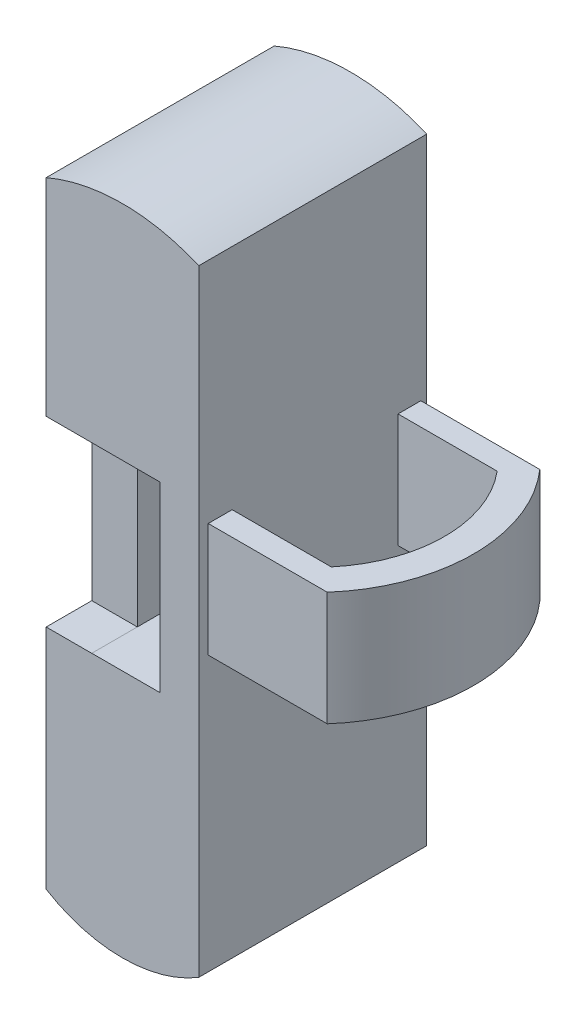
ISO-10303-21;
HEADER;
FILE_DESCRIPTION(('STEP AP214'),'2;1');
FILE_NAME('part.step','',(''),(''),'','','');
FILE_SCHEMA(('AUTOMOTIVE_DESIGN { 1 0 10303 214 1 1 1 1 }'));
ENDSEC;
DATA;
#1=APPLICATION_CONTEXT('core data for automotive mechanical design processes');
#2=APPLICATION_PROTOCOL_DEFINITION('international standard','automotive_design',2000,#1);
#3=PRODUCT_CONTEXT('',#1,'mechanical');
#4=PRODUCT('Part','Part','',(#3));
#5=PRODUCT_RELATED_PRODUCT_CATEGORY('part','',(#4));
#6=PRODUCT_DEFINITION_FORMATION('','',#4);
#7=PRODUCT_DEFINITION_CONTEXT('part definition',#1,'design');
#8=PRODUCT_DEFINITION('design','',#6,#7);
#9=PRODUCT_DEFINITION_SHAPE('','',#8);
#10=(LENGTH_UNIT() NAMED_UNIT(*) SI_UNIT(.MILLI.,.METRE.));
#11=(NAMED_UNIT(*) PLANE_ANGLE_UNIT() SI_UNIT($,.RADIAN.));
#12=(NAMED_UNIT(*) SI_UNIT($,.STERADIAN.) SOLID_ANGLE_UNIT());
#13=UNCERTAINTY_MEASURE_WITH_UNIT(LENGTH_MEASURE(1.E-05),#10,'distance_accuracy_value','');
#14=(GEOMETRIC_REPRESENTATION_CONTEXT(3) GLOBAL_UNCERTAINTY_ASSIGNED_CONTEXT((#13)) GLOBAL_UNIT_ASSIGNED_CONTEXT((#10,
#11,#12)) REPRESENTATION_CONTEXT('',''));
#15=CARTESIAN_POINT('',(0.,0.,0.));
#16=DIRECTION('',(0.,0.,1.));
#17=DIRECTION('',(1.,0.,0.));
#18=AXIS2_PLACEMENT_3D('',#15,#16,#17);
#19=CARTESIAN_POINT('',(0.,0.,10.));
#20=DIRECTION('',(1.,0.,0.));
#21=DIRECTION('',(0.,1.,0.));
#22=AXIS2_PLACEMENT_3D('',#19,#20,#21);
#23=PLANE('',#22);
#24=DIRECTION('',(0.,0.,1.));
#25=VECTOR('',#24,1.);
#26=CARTESIAN_POINT('',(0.,-17.069436100698,8.));
#27=LINE('',#26,#25);
#28=CARTESIAN_POINT('',(0.,-17.069436100698,8.));
#29=VERTEX_POINT('',#28);
#30=CARTESIAN_POINT('',(0.,-17.069436100698,10.));
#31=VERTEX_POINT('',#30);
#32=EDGE_CURVE('E213',#29,#31,#27,.T.);
#33=ORIENTED_EDGE('',*,*,#32,.F.);
#34=DIRECTION('',(0.,-1.,0.));
#35=VECTOR('',#34,1.);
#36=CARTESIAN_POINT('',(0.,-9.06722977852762,8.));
#37=LINE('',#36,#35);
#38=CARTESIAN_POINT('',(0.,-9.06722977852762,8.));
#39=VERTEX_POINT('',#38);
#40=EDGE_CURVE('E207',#39,#29,#37,.T.);
#41=ORIENTED_EDGE('',*,*,#40,.F.);
#42=DIRECTION('',(0.,0.,1.));
#43=VECTOR('',#42,1.);
#44=CARTESIAN_POINT('',(0.,-9.06722977852762,8.));
#45=LINE('',#44,#43);
#46=CARTESIAN_POINT('',(0.,-9.06722977852762,10.));
#47=VERTEX_POINT('',#46);
#48=EDGE_CURVE('E217',#39,#47,#45,.T.);
#49=ORIENTED_EDGE('',*,*,#48,.T.);
#50=DIRECTION('',(0.,-1.,0.));
#51=VECTOR('',#50,1.);
#52=CARTESIAN_POINT('',(0.,0.,10.));
#53=LINE('',#52,#51);
#54=CARTESIAN_POINT('',(0.,0.,10.));
#55=VERTEX_POINT('',#54);
#56=EDGE_CURVE('E323',#55,#47,#53,.T.);
#57=ORIENTED_EDGE('',*,*,#56,.F.);
#58=DIRECTION('',(0.,0.,-1.));
#59=VECTOR('',#58,1.);
#60=CARTESIAN_POINT('',(0.,0.,10.));
#61=LINE('',#60,#59);
#62=CARTESIAN_POINT('',(0.,0.,0.));
#63=VERTEX_POINT('',#62);
#64=EDGE_CURVE('E350',#55,#63,#61,.T.);
#65=ORIENTED_EDGE('',*,*,#64,.T.);
#66=DIRECTION('',(0.,-1.,0.));
#67=VECTOR('',#66,1.);
#68=CARTESIAN_POINT('',(0.,0.,0.));
#69=LINE('',#68,#67);
#70=CARTESIAN_POINT('',(0.,-9.06722977852762,0.));
#71=VERTEX_POINT('',#70);
#72=EDGE_CURVE('E336',#63,#71,#69,.T.);
#73=ORIENTED_EDGE('',*,*,#72,.T.);
#74=DIRECTION('',(0.,0.,-1.));
#75=VECTOR('',#74,1.);
#76=CARTESIAN_POINT('',(0.,-9.06722977852762,2.));
#77=LINE('',#76,#75);
#78=CARTESIAN_POINT('',(0.,-9.06722977852762,2.));
#79=VERTEX_POINT('',#78);
#80=EDGE_CURVE('E237',#79,#71,#77,.T.);
#81=ORIENTED_EDGE('',*,*,#80,.F.);
#82=DIRECTION('',(0.,-1.,0.));
#83=VECTOR('',#82,1.);
#84=CARTESIAN_POINT('',(0.,-9.06722977852762,2.));
#85=LINE('',#84,#83);
#86=CARTESIAN_POINT('',(0.,-17.0676967551913,2.));
#87=VERTEX_POINT('',#86);
#88=EDGE_CURVE('E228',#79,#87,#85,.T.);
#89=ORIENTED_EDGE('',*,*,#88,.T.);
#90=DIRECTION('',(0.,0.,-1.));
#91=VECTOR('',#90,1.);
#92=CARTESIAN_POINT('',(0.,-17.0676967551913,2.));
#93=LINE('',#92,#91);
#94=CARTESIAN_POINT('',(0.,-17.0676967551913,0.));
#95=VERTEX_POINT('',#94);
#96=EDGE_CURVE('E241',#87,#95,#93,.T.);
#97=ORIENTED_EDGE('',*,*,#96,.T.);
#98=CARTESIAN_POINT('',(0.,-27.0334551121408,0.));
#99=VERTEX_POINT('',#98);
#100=EDGE_CURVE('E335',#95,#99,#69,.T.);
#101=ORIENTED_EDGE('',*,*,#100,.T.);
#102=DIRECTION('',(0.,0.,-1.));
#103=VECTOR('',#102,1.);
#104=CARTESIAN_POINT('',(0.,-27.0334551121408,10.));
#105=LINE('',#104,#103);
#106=CARTESIAN_POINT('',(0.,-27.0334551121408,10.));
#107=VERTEX_POINT('',#106);
#108=EDGE_CURVE('E347',#107,#99,#105,.T.);
#109=ORIENTED_EDGE('',*,*,#108,.F.);
#110=EDGE_CURVE('E321',#31,#107,#53,.T.);
#111=ORIENTED_EDGE('',*,*,#110,.F.);
#112=EDGE_LOOP('',(#33,#41,#49,#57,#65,#73,#81,#89,#97,#101,#109,#111));
#113=FACE_BOUND('',#112,.T.);
#114=ADVANCED_FACE('F33',(#113),#23,.F.);
#115=CARTESIAN_POINT('',(3.34635971626795,-7.77356562745226,10.));
#116=DIRECTION('',(0.,0.,1.));
#117=DIRECTION('',(1.,0.,0.));
#118=AXIS2_PLACEMENT_3D('',#115,#116,#117);
#119=PLANE('',#118);
#120=DIRECTION('',(-1.,0.,0.));
#121=VECTOR('',#120,1.);
#122=CARTESIAN_POINT('',(5.,-17.0672297785276,10.));
#123=LINE('',#122,#121);
#124=CARTESIAN_POINT('',(5.,-17.0672297785276,10.));
#125=VERTEX_POINT('',#124);
#126=CARTESIAN_POINT('',(2.,-17.0672297785276,10.));
#127=VERTEX_POINT('',#126);
#128=EDGE_CURVE('E301',#125,#127,#123,.T.);
#129=ORIENTED_EDGE('',*,*,#128,.T.);
#130=DIRECTION('',(0.,-1.,0.));
#131=VECTOR('',#130,1.);
#132=CARTESIAN_POINT('',(2.,-9.06722977852762,10.));
#133=LINE('',#132,#131);
#134=CARTESIAN_POINT('',(2.,-17.069436100698,10.));
#135=VERTEX_POINT('',#134);
#136=EDGE_CURVE('E634',#127,#135,#133,.T.);
#137=ORIENTED_EDGE('',*,*,#136,.T.);
#138=DIRECTION('',(-1.,0.,0.));
#139=VECTOR('',#138,1.);
#140=CARTESIAN_POINT('',(2.,-17.069436100698,10.));
#141=LINE('',#140,#139);
#142=EDGE_CURVE('E201',#135,#31,#141,.T.);
#143=ORIENTED_EDGE('',*,*,#142,.T.);
#144=ORIENTED_EDGE('',*,*,#110,.T.);
#145=CARTESIAN_POINT('',(3.34635971626796,-21.5122519810606,10.));
#146=DIRECTION('',(0.,0.,-1.));
#147=DIRECTION('',(-1.,0.,0.));
#148=AXIS2_PLACEMENT_3D('',#145,#146,#147);
#149=CIRCLE('',#148,6.45614493063089);
#150=CARTESIAN_POINT('',(6.69271943253591,-27.0334551121408,10.));
#151=VERTEX_POINT('',#150);
#152=EDGE_CURVE('E326',#151,#107,#149,.T.);
#153=ORIENTED_EDGE('',*,*,#152,.F.);
#154=DIRECTION('',(0.,-1.,0.));
#155=VECTOR('',#154,1.);
#156=CARTESIAN_POINT('',(6.69271943253591,0.,10.));
#157=LINE('',#156,#155);
#158=CARTESIAN_POINT('',(6.69271943253591,0.,10.));
#159=VERTEX_POINT('',#158);
#160=EDGE_CURVE('E329',#159,#151,#157,.T.);
#161=ORIENTED_EDGE('',*,*,#160,.F.);
#162=CARTESIAN_POINT('',(3.34635971626795,-7.77356562745226,10.));
#163=DIRECTION('',(0.,0.,1.));
#164=DIRECTION('',(1.,0.,0.));
#165=AXIS2_PLACEMENT_3D('',#162,#163,#164);
#166=CIRCLE('',#165,8.46324086357987);
#167=EDGE_CURVE('E318',#159,#55,#166,.T.);
#168=ORIENTED_EDGE('',*,*,#167,.T.);
#169=ORIENTED_EDGE('',*,*,#56,.T.);
#170=DIRECTION('',(-1.,0.,0.));
#171=VECTOR('',#170,1.);
#172=CARTESIAN_POINT('',(5.,-9.06722977852762,10.));
#173=LINE('',#172,#171);
#174=CARTESIAN_POINT('',(5.,-9.06722977852762,10.));
#175=VERTEX_POINT('',#174);
#176=EDGE_CURVE('E293',#175,#47,#173,.T.);
#177=ORIENTED_EDGE('',*,*,#176,.F.);
#178=DIRECTION('',(0.,-1.,0.));
#179=VECTOR('',#178,1.);
#180=CARTESIAN_POINT('',(5.,-9.06722977852762,10.));
#181=LINE('',#180,#179);
#182=EDGE_CURVE('E289',#175,#125,#181,.T.);
#183=ORIENTED_EDGE('',*,*,#182,.T.);
#184=EDGE_LOOP('',(#129,#137,#143,#144,#153,#161,#168,#169,#177,#183));
#185=FACE_BOUND('',#184,.T.);
#186=ADVANCED_FACE('F406',(#185),#119,.T.);
#187=CARTESIAN_POINT('',(3.34635971626795,-7.77356562745226,0.));
#188=DIRECTION('',(0.,0.,1.));
#189=DIRECTION('',(1.,0.,0.));
#190=AXIS2_PLACEMENT_3D('',#187,#188,#189);
#191=PLANE('',#190);
#192=DIRECTION('',(-1.,0.,0.));
#193=VECTOR('',#192,1.);
#194=CARTESIAN_POINT('',(5.,-9.06722977852762,0.));
#195=LINE('',#194,#193);
#196=CARTESIAN_POINT('',(5.,-9.06722977852762,0.));
#197=VERTEX_POINT('',#196);
#198=EDGE_CURVE('E296',#197,#71,#195,.T.);
#199=ORIENTED_EDGE('',*,*,#198,.T.);
#200=ORIENTED_EDGE('',*,*,#72,.F.);
#201=CARTESIAN_POINT('',(3.34635971626795,-7.77356562745226,0.));
#202=DIRECTION('',(0.,0.,1.));
#203=DIRECTION('',(1.,0.,0.));
#204=AXIS2_PLACEMENT_3D('',#201,#202,#203);
#205=CIRCLE('',#204,8.46324086357987);
#206=CARTESIAN_POINT('',(6.69271943253591,0.,0.));
#207=VERTEX_POINT('',#206);
#208=EDGE_CURVE('E317',#207,#63,#205,.T.);
#209=ORIENTED_EDGE('',*,*,#208,.F.);
#210=DIRECTION('',(0.,-1.,0.));
#211=VECTOR('',#210,1.);
#212=CARTESIAN_POINT('',(6.69271943253591,0.,0.));
#213=LINE('',#212,#211);
#214=CARTESIAN_POINT('',(6.69271943253591,-27.0334551121408,0.));
#215=VERTEX_POINT('',#214);
#216=EDGE_CURVE('E322',#207,#215,#213,.T.);
#217=ORIENTED_EDGE('',*,*,#216,.T.);
#218=CARTESIAN_POINT('',(3.34635971626796,-21.5122519810606,0.));
#219=DIRECTION('',(0.,0.,-1.));
#220=DIRECTION('',(-1.,0.,0.));
#221=AXIS2_PLACEMENT_3D('',#218,#219,#220);
#222=CIRCLE('',#221,6.45614493063089);
#223=EDGE_CURVE('E339',#215,#99,#222,.T.);
#224=ORIENTED_EDGE('',*,*,#223,.T.);
#225=ORIENTED_EDGE('',*,*,#100,.F.);
#226=DIRECTION('',(-1.,0.,0.));
#227=VECTOR('',#226,1.);
#228=CARTESIAN_POINT('',(2.,-17.0676967551913,0.));
#229=LINE('',#228,#227);
#230=CARTESIAN_POINT('',(2.,-17.0676967551913,0.));
#231=VERTEX_POINT('',#230);
#232=EDGE_CURVE('E235',#231,#95,#229,.T.);
#233=ORIENTED_EDGE('',*,*,#232,.F.);
#234=DIRECTION('',(0.,-1.,0.));
#235=VECTOR('',#234,1.);
#236=CARTESIAN_POINT('',(2.,-9.06722977852762,0.));
#237=LINE('',#236,#235);
#238=CARTESIAN_POINT('',(2.,-17.0672297785276,0.));
#239=VERTEX_POINT('',#238);
#240=EDGE_CURVE('E215',#239,#231,#237,.T.);
#241=ORIENTED_EDGE('',*,*,#240,.F.);
#242=DIRECTION('',(-1.,0.,0.));
#243=VECTOR('',#242,1.);
#244=CARTESIAN_POINT('',(5.,-17.0672297785276,0.));
#245=LINE('',#244,#243);
#246=CARTESIAN_POINT('',(5.,-17.0672297785276,0.));
#247=VERTEX_POINT('',#246);
#248=EDGE_CURVE('E292',#247,#239,#245,.T.);
#249=ORIENTED_EDGE('',*,*,#248,.F.);
#250=DIRECTION('',(0.,-1.,0.));
#251=VECTOR('',#250,1.);
#252=CARTESIAN_POINT('',(5.,-9.06722977852762,0.));
#253=LINE('',#252,#251);
#254=EDGE_CURVE('E290',#197,#247,#253,.T.);
#255=ORIENTED_EDGE('',*,*,#254,.F.);
#256=EDGE_LOOP('',(#199,#200,#209,#217,#224,#225,#233,#241,#249,#255));
#257=FACE_BOUND('',#256,.T.);
#258=ADVANCED_FACE('F411',(#257),#191,.F.);
#259=CARTESIAN_POINT('',(2.,-9.06722977852762,0.));
#260=DIRECTION('',(-1.,0.,0.));
#261=DIRECTION('',(0.,-1.,0.));
#262=AXIS2_PLACEMENT_3D('',#259,#260,#261);
#263=PLANE('',#262);
#264=DIRECTION('',(0.,0.,1.));
#265=VECTOR('',#264,1.);
#266=CARTESIAN_POINT('',(2.,-9.06722977852762,0.));
#267=LINE('',#266,#265);
#268=CARTESIAN_POINT('',(2.,-9.06722977852762,2.));
#269=VERTEX_POINT('',#268);
#270=CARTESIAN_POINT('',(2.,-9.06722977852762,8.));
#271=VERTEX_POINT('',#270);
#272=EDGE_CURVE('E307',#269,#271,#267,.T.);
#273=ORIENTED_EDGE('',*,*,#272,.T.);
#274=DIRECTION('',(0.,-1.,0.));
#275=VECTOR('',#274,1.);
#276=CARTESIAN_POINT('',(2.,-9.06722977852762,8.));
#277=LINE('',#276,#275);
#278=CARTESIAN_POINT('',(2.,-17.0672297785276,8.));
#279=VERTEX_POINT('',#278);
#280=EDGE_CURVE('E200',#271,#279,#277,.T.);
#281=ORIENTED_EDGE('',*,*,#280,.T.);
#282=DIRECTION('',(0.,0.,1.));
#283=VECTOR('',#282,1.);
#284=CARTESIAN_POINT('',(2.,-17.0672297785276,0.));
#285=LINE('',#284,#283);
#286=CARTESIAN_POINT('',(2.,-17.0672297785276,2.));
#287=VERTEX_POINT('',#286);
#288=EDGE_CURVE('E310',#287,#279,#285,.T.);
#289=ORIENTED_EDGE('',*,*,#288,.F.);
#290=DIRECTION('',(0.,-1.,0.));
#291=VECTOR('',#290,1.);
#292=CARTESIAN_POINT('',(2.,-9.06722977852762,2.));
#293=LINE('',#292,#291);
#294=EDGE_CURVE('E221',#269,#287,#293,.T.);
#295=ORIENTED_EDGE('',*,*,#294,.F.);
#296=EDGE_LOOP('',(#273,#281,#289,#295));
#297=FACE_BOUND('',#296,.T.);
#298=ADVANCED_FACE('F423',(#297),#263,.F.);
#299=CARTESIAN_POINT('',(6.61911128902171,-10.,4.92153699914496));
#300=DIRECTION('',(0.,1.,0.));
#301=DIRECTION('',(0.,0.,1.));
#302=AXIS2_PLACEMENT_3D('',#299,#300,#301);
#303=PLANE('',#302);
#304=DIRECTION('',(0.,0.,1.));
#305=VECTOR('',#304,1.);
#306=CARTESIAN_POINT('',(6.69271943253591,-10.,10.));
#307=LINE('',#306,#305);
#308=CARTESIAN_POINT('',(6.69271943253591,-10.,0.259272684136247));
#309=VERTEX_POINT('',#308);
#310=CARTESIAN_POINT('',(6.69271943253591,-10.,1.25927268413625));
#311=VERTEX_POINT('',#310);
#312=EDGE_CURVE('E11',#309,#311,#307,.T.);
#313=ORIENTED_EDGE('',*,*,#312,.T.);
#314=DIRECTION('',(1.,0.,0.));
#315=VECTOR('',#314,1.);
#316=CARTESIAN_POINT('',(6.69271943253591,-10.,1.25927268413625));
#317=LINE('',#316,#315);
#318=CARTESIAN_POINT('',(11.0392031930928,-10.,1.25927268413625));
#319=VERTEX_POINT('',#318);
#320=EDGE_CURVE('E240',#311,#319,#317,.T.);
#321=ORIENTED_EDGE('',*,*,#320,.T.);
#322=CARTESIAN_POINT('',(6.73266582048928,-10.,4.89726198568127));
#323=DIRECTION('',(0.,-1.,0.));
#324=DIRECTION('',(0.,0.,-1.));
#325=AXIS2_PLACEMENT_3D('',#322,#323,#324);
#326=CIRCLE('',#325,5.637484394638);
#327=CARTESIAN_POINT('',(11.0392031930928,-10.,8.53525128722629));
#328=VERTEX_POINT('',#327);
#329=EDGE_CURVE('E257',#319,#328,#326,.T.);
#330=ORIENTED_EDGE('',*,*,#329,.T.);
#331=DIRECTION('',(1.,0.,0.));
#332=VECTOR('',#331,1.);
#333=CARTESIAN_POINT('',(6.69271943253591,-10.,8.53525128722629));
#334=LINE('',#333,#332);
#335=CARTESIAN_POINT('',(6.69271943253591,-10.,8.53525128722629));
#336=VERTEX_POINT('',#335);
#337=EDGE_CURVE('E249',#336,#328,#334,.T.);
#338=ORIENTED_EDGE('',*,*,#337,.F.);
#339=CARTESIAN_POINT('',(6.69271943253591,-10.,9.58380131415367));
#340=VERTEX_POINT('',#339);
#341=EDGE_CURVE('E41',#336,#340,#307,.T.);
#342=ORIENTED_EDGE('',*,*,#341,.T.);
#343=DIRECTION('',(1.,0.,0.));
#344=VECTOR('',#343,1.);
#345=CARTESIAN_POINT('',(6.30869555292225,-10.,9.58380131415367));
#346=LINE('',#345,#344);
#347=CARTESIAN_POINT('',(11.9124232644481,-10.,9.58380131415367));
#348=VERTEX_POINT('',#347);
#349=EDGE_CURVE('E270',#340,#348,#346,.T.);
#350=ORIENTED_EDGE('',*,*,#349,.T.);
#351=CARTESIAN_POINT('',(6.61911128902171,-10.,4.92153699914496));
#352=DIRECTION('',(0.,1.,0.));
#353=DIRECTION('',(0.,0.,1.));
#354=AXIS2_PLACEMENT_3D('',#351,#352,#353);
#355=CIRCLE('',#354,7.05378339702857);
#356=CARTESIAN_POINT('',(11.9124232644481,-10.,0.259272684136248));
#357=VERTEX_POINT('',#356);
#358=EDGE_CURVE('E272',#348,#357,#355,.T.);
#359=ORIENTED_EDGE('',*,*,#358,.T.);
#360=DIRECTION('',(1.,0.,0.));
#361=VECTOR('',#360,1.);
#362=CARTESIAN_POINT('',(6.30869555292225,-10.,0.259272684136247));
#363=LINE('',#362,#361);
#364=EDGE_CURVE('E276',#309,#357,#363,.T.);
#365=ORIENTED_EDGE('',*,*,#364,.F.);
#366=EDGE_LOOP('',(#313,#321,#330,#338,#342,#350,#359,#365));
#367=FACE_BOUND('',#366,.T.);
#368=ADVANCED_FACE('F365',(#367),#303,.T.);
#369=CARTESIAN_POINT('',(6.61911128902171,-15.,4.92153699914496));
#370=DIRECTION('',(0.,1.,0.));
#371=DIRECTION('',(0.,0.,1.));
#372=AXIS2_PLACEMENT_3D('',#369,#370,#371);
#373=PLANE('',#372);
#374=DIRECTION('',(1.,0.,0.));
#375=VECTOR('',#374,1.);
#376=CARTESIAN_POINT('',(6.69271943253591,-15.,1.25927268413625));
#377=LINE('',#376,#375);
#378=CARTESIAN_POINT('',(6.69271943253591,-15.,1.25927268413625));
#379=VERTEX_POINT('',#378);
#380=CARTESIAN_POINT('',(11.0392031930928,-15.,1.25927268413625));
#381=VERTEX_POINT('',#380);
#382=EDGE_CURVE('E246',#379,#381,#377,.T.);
#383=ORIENTED_EDGE('',*,*,#382,.F.);
#384=DIRECTION('',(0.,0.,1.));
#385=VECTOR('',#384,1.);
#386=CARTESIAN_POINT('',(6.69271943253591,-15.,10.));
#387=LINE('',#386,#385);
#388=CARTESIAN_POINT('',(6.69271943253591,-15.,0.259272684136247));
#389=VERTEX_POINT('',#388);
#390=EDGE_CURVE('E354',#389,#379,#387,.T.);
#391=ORIENTED_EDGE('',*,*,#390,.F.);
#392=DIRECTION('',(1.,0.,0.));
#393=VECTOR('',#392,1.);
#394=CARTESIAN_POINT('',(6.30869555292225,-15.,0.259272684136247));
#395=LINE('',#394,#393);
#396=CARTESIAN_POINT('',(11.9124232644481,-15.,0.259272684136248));
#397=VERTEX_POINT('',#396);
#398=EDGE_CURVE('E273',#389,#397,#395,.T.);
#399=ORIENTED_EDGE('',*,*,#398,.T.);
#400=CARTESIAN_POINT('',(6.61911128902171,-15.,4.92153699914496));
#401=DIRECTION('',(0.,1.,0.));
#402=DIRECTION('',(0.,0.,1.));
#403=AXIS2_PLACEMENT_3D('',#400,#401,#402);
#404=CIRCLE('',#403,7.05378339702857);
#405=CARTESIAN_POINT('',(11.9124232644481,-15.,9.58380131415367));
#406=VERTEX_POINT('',#405);
#407=EDGE_CURVE('E280',#406,#397,#404,.T.);
#408=ORIENTED_EDGE('',*,*,#407,.F.);
#409=DIRECTION('',(1.,0.,0.));
#410=VECTOR('',#409,1.);
#411=CARTESIAN_POINT('',(6.30869555292225,-15.,9.58380131415367));
#412=LINE('',#411,#410);
#413=CARTESIAN_POINT('',(6.69271943253591,-15.,9.58380131415367));
#414=VERTEX_POINT('',#413);
#415=EDGE_CURVE('E269',#414,#406,#412,.T.);
#416=ORIENTED_EDGE('',*,*,#415,.F.);
#417=CARTESIAN_POINT('',(6.69271943253591,-15.,8.53525128722629));
#418=VERTEX_POINT('',#417);
#419=EDGE_CURVE('E353',#418,#414,#387,.T.);
#420=ORIENTED_EDGE('',*,*,#419,.F.);
#421=DIRECTION('',(1.,0.,0.));
#422=VECTOR('',#421,1.);
#423=CARTESIAN_POINT('',(6.69271943253591,-15.,8.53525128722629));
#424=LINE('',#423,#422);
#425=CARTESIAN_POINT('',(11.0392031930928,-15.,8.53525128722629));
#426=VERTEX_POINT('',#425);
#427=EDGE_CURVE('E252',#418,#426,#424,.T.);
#428=ORIENTED_EDGE('',*,*,#427,.T.);
#429=CARTESIAN_POINT('',(6.73266582048928,-15.,4.89726198568127));
#430=DIRECTION('',(0.,-1.,0.));
#431=DIRECTION('',(0.,0.,-1.));
#432=AXIS2_PLACEMENT_3D('',#429,#430,#431);
#433=CIRCLE('',#432,5.637484394638);
#434=EDGE_CURVE('E248',#381,#426,#433,.T.);
#435=ORIENTED_EDGE('',*,*,#434,.F.);
#436=EDGE_LOOP('',(#383,#391,#399,#408,#416,#420,#428,#435));
#437=FACE_BOUND('',#436,.T.);
#438=ADVANCED_FACE('F387',(#437),#373,.F.);
#439=CARTESIAN_POINT('',(3.34635971626795,-7.77356562745226,10.));
#440=DIRECTION('',(0.,0.,-1.));
#441=DIRECTION('',(-1.,0.,0.));
#442=AXIS2_PLACEMENT_3D('',#439,#440,#441);
#443=CYLINDRICAL_SURFACE('',#442,8.46324086357987);
#444=ORIENTED_EDGE('',*,*,#208,.T.);
#445=ORIENTED_EDGE('',*,*,#64,.F.);
#446=ORIENTED_EDGE('',*,*,#167,.F.);
#447=DIRECTION('',(0.,0.,-1.));
#448=VECTOR('',#447,1.);
#449=CARTESIAN_POINT('',(6.69271943253591,0.,10.));
#450=LINE('',#449,#448);
#451=EDGE_CURVE('E332',#159,#207,#450,.T.);
#452=ORIENTED_EDGE('',*,*,#451,.T.);
#453=EDGE_LOOP('',(#444,#445,#446,#452));
#454=FACE_BOUND('',#453,.T.);
#455=ADVANCED_FACE('F35',(#454),#443,.T.);
#456=CARTESIAN_POINT('',(3.34635971626796,-21.5122519810606,10.));
#457=DIRECTION('',(0.,0.,-1.));
#458=DIRECTION('',(-1.,0.,0.));
#459=AXIS2_PLACEMENT_3D('',#456,#457,#458);
#460=CYLINDRICAL_SURFACE('',#459,6.45614493063089);
#461=ORIENTED_EDGE('',*,*,#223,.F.);
#462=DIRECTION('',(0.,0.,-1.));
#463=VECTOR('',#462,1.);
#464=CARTESIAN_POINT('',(6.69271943253591,-27.0334551121408,10.));
#465=LINE('',#464,#463);
#466=EDGE_CURVE('E345',#151,#215,#465,.T.);
#467=ORIENTED_EDGE('',*,*,#466,.F.);
#468=ORIENTED_EDGE('',*,*,#152,.T.);
#469=ORIENTED_EDGE('',*,*,#108,.T.);
#470=EDGE_LOOP('',(#461,#467,#468,#469));
#471=FACE_BOUND('',#470,.T.);
#472=ADVANCED_FACE('F415',(#471),#460,.T.);
#473=CARTESIAN_POINT('',(6.69271943253591,0.,10.));
#474=DIRECTION('',(1.,0.,0.));
#475=DIRECTION('',(0.,1.,0.));
#476=AXIS2_PLACEMENT_3D('',#473,#474,#475);
#477=PLANE('',#476);
#478=DIRECTION('',(0.,1.,0.));
#479=VECTOR('',#478,1.);
#480=CARTESIAN_POINT('',(6.69271943253591,-15.,1.25927268413625));
#481=LINE('',#480,#479);
#482=EDGE_CURVE('E266',#379,#311,#481,.T.);
#483=ORIENTED_EDGE('',*,*,#482,.T.);
#484=ORIENTED_EDGE('',*,*,#312,.F.);
#485=DIRECTION('',(0.,1.,0.));
#486=VECTOR('',#485,1.);
#487=CARTESIAN_POINT('',(6.69271943253591,0.,0.259272684136247));
#488=LINE('',#487,#486);
#489=EDGE_CURVE('E357',#389,#309,#488,.T.);
#490=ORIENTED_EDGE('',*,*,#489,.F.);
#491=ORIENTED_EDGE('',*,*,#390,.T.);
#492=EDGE_LOOP('',(#483,#484,#490,#491));
#493=FACE_BOUND('',#492,.T.);
#494=ORIENTED_EDGE('',*,*,#341,.F.);
#495=DIRECTION('',(0.,1.,0.));
#496=VECTOR('',#495,1.);
#497=CARTESIAN_POINT('',(6.69271943253591,-15.,8.53525128722629));
#498=LINE('',#497,#496);
#499=EDGE_CURVE('E56',#418,#336,#498,.T.);
#500=ORIENTED_EDGE('',*,*,#499,.F.);
#501=ORIENTED_EDGE('',*,*,#419,.T.);
#502=DIRECTION('',(0.,1.,0.));
#503=VECTOR('',#502,1.);
#504=CARTESIAN_POINT('',(6.69271943253591,0.,9.58380131415367));
#505=LINE('',#504,#503);
#506=EDGE_CURVE('E358',#414,#340,#505,.T.);
#507=ORIENTED_EDGE('',*,*,#506,.T.);
#508=EDGE_LOOP('',(#494,#500,#501,#507));
#509=FACE_BOUND('',#508,.T.);
#510=ORIENTED_EDGE('',*,*,#216,.F.);
#511=ORIENTED_EDGE('',*,*,#451,.F.);
#512=ORIENTED_EDGE('',*,*,#160,.T.);
#513=ORIENTED_EDGE('',*,*,#466,.T.);
#514=EDGE_LOOP('',(#510,#511,#512,#513));
#515=FACE_BOUND('',#514,.T.);
#516=ADVANCED_FACE('F380',(#493,#509,#515),#477,.T.);
#517=CARTESIAN_POINT('',(5.,-9.06722977852762,0.));
#518=DIRECTION('',(-1.,0.,0.));
#519=DIRECTION('',(0.,-1.,0.));
#520=AXIS2_PLACEMENT_3D('',#517,#518,#519);
#521=PLANE('',#520);
#522=ORIENTED_EDGE('',*,*,#182,.F.);
#523=DIRECTION('',(0.,0.,1.));
#524=VECTOR('',#523,1.);
#525=CARTESIAN_POINT('',(5.,-9.06722977852762,0.));
#526=LINE('',#525,#524);
#527=EDGE_CURVE('E298',#197,#175,#526,.T.);
#528=ORIENTED_EDGE('',*,*,#527,.F.);
#529=ORIENTED_EDGE('',*,*,#254,.T.);
#530=DIRECTION('',(0.,0.,1.));
#531=VECTOR('',#530,1.);
#532=CARTESIAN_POINT('',(5.,-17.0672297785276,0.));
#533=LINE('',#532,#531);
#534=EDGE_CURVE('E314',#247,#125,#533,.T.);
#535=ORIENTED_EDGE('',*,*,#534,.T.);
#536=EDGE_LOOP('',(#522,#528,#529,#535));
#537=FACE_BOUND('',#536,.T.);
#538=ADVANCED_FACE('F421',(#537),#521,.T.);
#539=CARTESIAN_POINT('',(5.,-17.0672297785276,0.));
#540=DIRECTION('',(0.,1.,0.));
#541=DIRECTION('',(0.,0.,1.));
#542=AXIS2_PLACEMENT_3D('',#539,#540,#541);
#543=PLANE('',#542);
#544=ORIENTED_EDGE('',*,*,#128,.F.);
#545=ORIENTED_EDGE('',*,*,#534,.F.);
#546=ORIENTED_EDGE('',*,*,#248,.T.);
#547=EDGE_CURVE('E311',#239,#287,#285,.T.);
#548=ORIENTED_EDGE('',*,*,#547,.T.);
#549=ORIENTED_EDGE('',*,*,#288,.T.);
#550=DIRECTION('',(0.,0.,1.));
#551=VECTOR('',#550,1.);
#552=CARTESIAN_POINT('',(2.,-17.0672297785276,0.));
#553=LINE('',#552,#551);
#554=EDGE_CURVE('E197',#279,#127,#553,.T.);
#555=ORIENTED_EDGE('',*,*,#554,.T.);
#556=EDGE_LOOP('',(#544,#545,#546,#548,#549,#555));
#557=FACE_BOUND('',#556,.T.);
#558=ADVANCED_FACE('F428',(#557),#543,.T.);
#559=CARTESIAN_POINT('',(5.,-9.06722977852762,0.));
#560=DIRECTION('',(0.,1.,0.));
#561=DIRECTION('',(0.,0.,1.));
#562=AXIS2_PLACEMENT_3D('',#559,#560,#561);
#563=PLANE('',#562);
#564=ORIENTED_EDGE('',*,*,#176,.T.);
#565=ORIENTED_EDGE('',*,*,#48,.F.);
#566=DIRECTION('',(-1.,0.,0.));
#567=VECTOR('',#566,1.);
#568=CARTESIAN_POINT('',(2.,-9.06722977852762,8.));
#569=LINE('',#568,#567);
#570=EDGE_CURVE('E48',#271,#39,#569,.T.);
#571=ORIENTED_EDGE('',*,*,#570,.F.);
#572=ORIENTED_EDGE('',*,*,#272,.F.);
#573=DIRECTION('',(-1.,0.,0.));
#574=VECTOR('',#573,1.);
#575=CARTESIAN_POINT('',(2.,-9.06722977852762,2.));
#576=LINE('',#575,#574);
#577=EDGE_CURVE('E231',#269,#79,#576,.T.);
#578=ORIENTED_EDGE('',*,*,#577,.T.);
#579=ORIENTED_EDGE('',*,*,#80,.T.);
#580=ORIENTED_EDGE('',*,*,#198,.F.);
#581=ORIENTED_EDGE('',*,*,#527,.T.);
#582=EDGE_LOOP('',(#564,#565,#571,#572,#578,#579,#580,#581));
#583=FACE_BOUND('',#582,.T.);
#584=ADVANCED_FACE('F432',(#583),#563,.F.);
#585=CARTESIAN_POINT('',(6.30869555292225,-10.,9.58380131415367));
#586=DIRECTION('',(0.,0.,-1.));
#587=DIRECTION('',(-1.,0.,0.));
#588=AXIS2_PLACEMENT_3D('',#585,#586,#587);
#589=PLANE('',#588);
#590=ORIENTED_EDGE('',*,*,#506,.F.);
#591=ORIENTED_EDGE('',*,*,#415,.T.);
#592=DIRECTION('',(0.,-1.,0.));
#593=VECTOR('',#592,1.);
#594=CARTESIAN_POINT('',(11.9124232644481,-10.,9.58380131415367));
#595=LINE('',#594,#593);
#596=EDGE_CURVE('E286',#348,#406,#595,.T.);
#597=ORIENTED_EDGE('',*,*,#596,.F.);
#598=ORIENTED_EDGE('',*,*,#349,.F.);
#599=EDGE_LOOP('',(#590,#591,#597,#598));
#600=FACE_BOUND('',#599,.T.);
#601=ADVANCED_FACE('F369',(#600),#589,.F.);
#602=CARTESIAN_POINT('',(6.61911128902171,-10.,4.92153699914496));
#603=DIRECTION('',(0.,-1.,0.));
#604=DIRECTION('',(0.,0.,-1.));
#605=AXIS2_PLACEMENT_3D('',#602,#603,#604);
#606=CYLINDRICAL_SURFACE('',#605,7.05378339702857);
#607=ORIENTED_EDGE('',*,*,#407,.T.);
#608=DIRECTION('',(0.,-1.,0.));
#609=VECTOR('',#608,1.);
#610=CARTESIAN_POINT('',(11.9124232644481,-10.,0.259272684136248));
#611=LINE('',#610,#609);
#612=EDGE_CURVE('E278',#357,#397,#611,.T.);
#613=ORIENTED_EDGE('',*,*,#612,.F.);
#614=ORIENTED_EDGE('',*,*,#358,.F.);
#615=ORIENTED_EDGE('',*,*,#596,.T.);
#616=EDGE_LOOP('',(#607,#613,#614,#615));
#617=FACE_BOUND('',#616,.T.);
#618=ADVANCED_FACE('F373',(#617),#606,.T.);
#619=CARTESIAN_POINT('',(6.30869555292225,-10.,0.259272684136247));
#620=DIRECTION('',(0.,0.,-1.));
#621=DIRECTION('',(-1.,0.,0.));
#622=AXIS2_PLACEMENT_3D('',#619,#620,#621);
#623=PLANE('',#622);
#624=ORIENTED_EDGE('',*,*,#398,.F.);
#625=ORIENTED_EDGE('',*,*,#489,.T.);
#626=ORIENTED_EDGE('',*,*,#364,.T.);
#627=ORIENTED_EDGE('',*,*,#612,.T.);
#628=EDGE_LOOP('',(#624,#625,#626,#627));
#629=FACE_BOUND('',#628,.T.);
#630=ADVANCED_FACE('F443',(#629),#623,.T.);
#631=CARTESIAN_POINT('',(6.69271943253591,-15.,1.25927268413625));
#632=DIRECTION('',(0.,0.,1.));
#633=DIRECTION('',(1.,0.,0.));
#634=AXIS2_PLACEMENT_3D('',#631,#632,#633);
#635=PLANE('',#634);
#636=ORIENTED_EDGE('',*,*,#320,.F.);
#637=ORIENTED_EDGE('',*,*,#482,.F.);
#638=ORIENTED_EDGE('',*,*,#382,.T.);
#639=DIRECTION('',(0.,1.,0.));
#640=VECTOR('',#639,1.);
#641=CARTESIAN_POINT('',(11.0392031930928,-15.,1.25927268413625));
#642=LINE('',#641,#640);
#643=EDGE_CURVE('E264',#381,#319,#642,.T.);
#644=ORIENTED_EDGE('',*,*,#643,.T.);
#645=EDGE_LOOP('',(#636,#637,#638,#644));
#646=FACE_BOUND('',#645,.T.);
#647=ADVANCED_FACE('F383',(#646),#635,.T.);
#648=CARTESIAN_POINT('',(6.73266582048928,-15.,4.89726198568127));
#649=DIRECTION('',(0.,1.,0.));
#650=DIRECTION('',(0.,0.,1.));
#651=AXIS2_PLACEMENT_3D('',#648,#649,#650);
#652=CYLINDRICAL_SURFACE('',#651,5.637484394638);
#653=ORIENTED_EDGE('',*,*,#329,.F.);
#654=ORIENTED_EDGE('',*,*,#643,.F.);
#655=ORIENTED_EDGE('',*,*,#434,.T.);
#656=DIRECTION('',(0.,1.,0.));
#657=VECTOR('',#656,1.);
#658=CARTESIAN_POINT('',(11.0392031930928,-15.,8.53525128722629));
#659=LINE('',#658,#657);
#660=EDGE_CURVE('E262',#426,#328,#659,.T.);
#661=ORIENTED_EDGE('',*,*,#660,.T.);
#662=EDGE_LOOP('',(#653,#654,#655,#661));
#663=FACE_BOUND('',#662,.T.);
#664=ADVANCED_FACE('F392',(#663),#652,.F.);
#665=CARTESIAN_POINT('',(6.69271943253591,-15.,8.53525128722629));
#666=DIRECTION('',(0.,0.,1.));
#667=DIRECTION('',(1.,0.,0.));
#668=AXIS2_PLACEMENT_3D('',#665,#666,#667);
#669=PLANE('',#668);
#670=ORIENTED_EDGE('',*,*,#337,.T.);
#671=ORIENTED_EDGE('',*,*,#660,.F.);
#672=ORIENTED_EDGE('',*,*,#427,.F.);
#673=ORIENTED_EDGE('',*,*,#499,.T.);
#674=EDGE_LOOP('',(#670,#671,#672,#673));
#675=FACE_BOUND('',#674,.T.);
#676=ADVANCED_FACE('F393',(#675),#669,.F.);
#677=CARTESIAN_POINT('',(2.,-9.06722977852762,2.));
#678=DIRECTION('',(1.,0.,0.));
#679=DIRECTION('',(0.,0.,-1.));
#680=AXIS2_PLACEMENT_3D('',#677,#678,#679);
#681=PLANE('',#680);
#682=ORIENTED_EDGE('',*,*,#547,.F.);
#683=ORIENTED_EDGE('',*,*,#240,.T.);
#684=DIRECTION('',(0.,0.,-1.));
#685=VECTOR('',#684,1.);
#686=CARTESIAN_POINT('',(2.,-17.0676967551913,2.));
#687=LINE('',#686,#685);
#688=CARTESIAN_POINT('',(2.,-17.0676967551913,2.));
#689=VERTEX_POINT('',#688);
#690=EDGE_CURVE('E233',#689,#231,#687,.T.);
#691=ORIENTED_EDGE('',*,*,#690,.F.);
#692=EDGE_CURVE('E225',#287,#689,#293,.T.);
#693=ORIENTED_EDGE('',*,*,#692,.F.);
#694=EDGE_LOOP('',(#682,#683,#691,#693));
#695=FACE_BOUND('',#694,.T.);
#696=ADVANCED_FACE('F395',(#695),#681,.F.);
#697=CARTESIAN_POINT('',(2.,-17.0676967551913,2.));
#698=DIRECTION('',(0.,-1.,0.));
#699=DIRECTION('',(0.,0.,-1.));
#700=AXIS2_PLACEMENT_3D('',#697,#698,#699);
#701=PLANE('',#700);
#702=ORIENTED_EDGE('',*,*,#232,.T.);
#703=ORIENTED_EDGE('',*,*,#96,.F.);
#704=DIRECTION('',(-1.,0.,0.));
#705=VECTOR('',#704,1.);
#706=CARTESIAN_POINT('',(2.,-17.0676967551913,2.));
#707=LINE('',#706,#705);
#708=EDGE_CURVE('E224',#689,#87,#707,.T.);
#709=ORIENTED_EDGE('',*,*,#708,.F.);
#710=ORIENTED_EDGE('',*,*,#690,.T.);
#711=EDGE_LOOP('',(#702,#703,#709,#710));
#712=FACE_BOUND('',#711,.T.);
#713=ADVANCED_FACE('F401',(#712),#701,.F.);
#714=CARTESIAN_POINT('',(0.,0.,2.));
#715=DIRECTION('',(0.,0.,-1.));
#716=DIRECTION('',(-1.,0.,0.));
#717=AXIS2_PLACEMENT_3D('',#714,#715,#716);
#718=PLANE('',#717);
#719=ORIENTED_EDGE('',*,*,#294,.T.);
#720=ORIENTED_EDGE('',*,*,#692,.T.);
#721=ORIENTED_EDGE('',*,*,#708,.T.);
#722=ORIENTED_EDGE('',*,*,#88,.F.);
#723=ORIENTED_EDGE('',*,*,#577,.F.);
#724=EDGE_LOOP('',(#719,#720,#721,#722,#723));
#725=FACE_BOUND('',#724,.T.);
#726=ADVANCED_FACE('F487',(#725),#718,.T.);
#727=CARTESIAN_POINT('',(2.,-9.06722977852762,8.));
#728=DIRECTION('',(-1.,0.,0.));
#729=DIRECTION('',(0.,0.,1.));
#730=AXIS2_PLACEMENT_3D('',#727,#728,#729);
#731=PLANE('',#730);
#732=CARTESIAN_POINT('',(2.,-17.069436100698,8.));
#733=VERTEX_POINT('',#732);
#734=EDGE_CURVE('E190',#279,#733,#277,.T.);
#735=ORIENTED_EDGE('',*,*,#734,.T.);
#736=DIRECTION('',(0.,0.,1.));
#737=VECTOR('',#736,1.);
#738=CARTESIAN_POINT('',(2.,-17.069436100698,8.));
#739=LINE('',#738,#737);
#740=EDGE_CURVE('E194',#733,#135,#739,.T.);
#741=ORIENTED_EDGE('',*,*,#740,.T.);
#742=ORIENTED_EDGE('',*,*,#136,.F.);
#743=ORIENTED_EDGE('',*,*,#554,.F.);
#744=EDGE_LOOP('',(#735,#741,#742,#743));
#745=FACE_BOUND('',#744,.T.);
#746=ADVANCED_FACE('F192',(#745),#731,.T.);
#747=CARTESIAN_POINT('',(2.,-17.069436100698,8.));
#748=DIRECTION('',(0.,1.,0.));
#749=DIRECTION('',(0.,0.,1.));
#750=AXIS2_PLACEMENT_3D('',#747,#748,#749);
#751=PLANE('',#750);
#752=ORIENTED_EDGE('',*,*,#142,.F.);
#753=ORIENTED_EDGE('',*,*,#740,.F.);
#754=DIRECTION('',(-1.,0.,0.));
#755=VECTOR('',#754,1.);
#756=CARTESIAN_POINT('',(2.,-17.069436100698,8.));
#757=LINE('',#756,#755);
#758=EDGE_CURVE('E204',#733,#29,#757,.T.);
#759=ORIENTED_EDGE('',*,*,#758,.T.);
#760=ORIENTED_EDGE('',*,*,#32,.T.);
#761=EDGE_LOOP('',(#752,#753,#759,#760));
#762=FACE_BOUND('',#761,.T.);
#763=ADVANCED_FACE('F211',(#762),#751,.T.);
#764=CARTESIAN_POINT('',(0.,0.,8.));
#765=DIRECTION('',(0.,0.,-1.));
#766=DIRECTION('',(-1.,0.,0.));
#767=AXIS2_PLACEMENT_3D('',#764,#765,#766);
#768=PLANE('',#767);
#769=ORIENTED_EDGE('',*,*,#280,.F.);
#770=ORIENTED_EDGE('',*,*,#570,.T.);
#771=ORIENTED_EDGE('',*,*,#40,.T.);
#772=ORIENTED_EDGE('',*,*,#758,.F.);
#773=ORIENTED_EDGE('',*,*,#734,.F.);
#774=EDGE_LOOP('',(#769,#770,#771,#772,#773));
#775=FACE_BOUND('',#774,.T.);
#776=ADVANCED_FACE('F205',(#775),#768,.F.);
#777=CLOSED_SHELL('',(#114,#186,#258,#298,#368,#438,#455,#472,#516,#538,#558,#584,#601,#618,
#630,#647,#664,#676,#696,#713,#726,#746,#763,#776));
#778=MANIFOLD_SOLID_BREP('B2',#777);
#779=ADVANCED_BREP_SHAPE_REPRESENTATION('',(#18,#778),#14);
#780=SHAPE_DEFINITION_REPRESENTATION(#9,#779);
ENDSEC;
END-ISO-10303-21;
